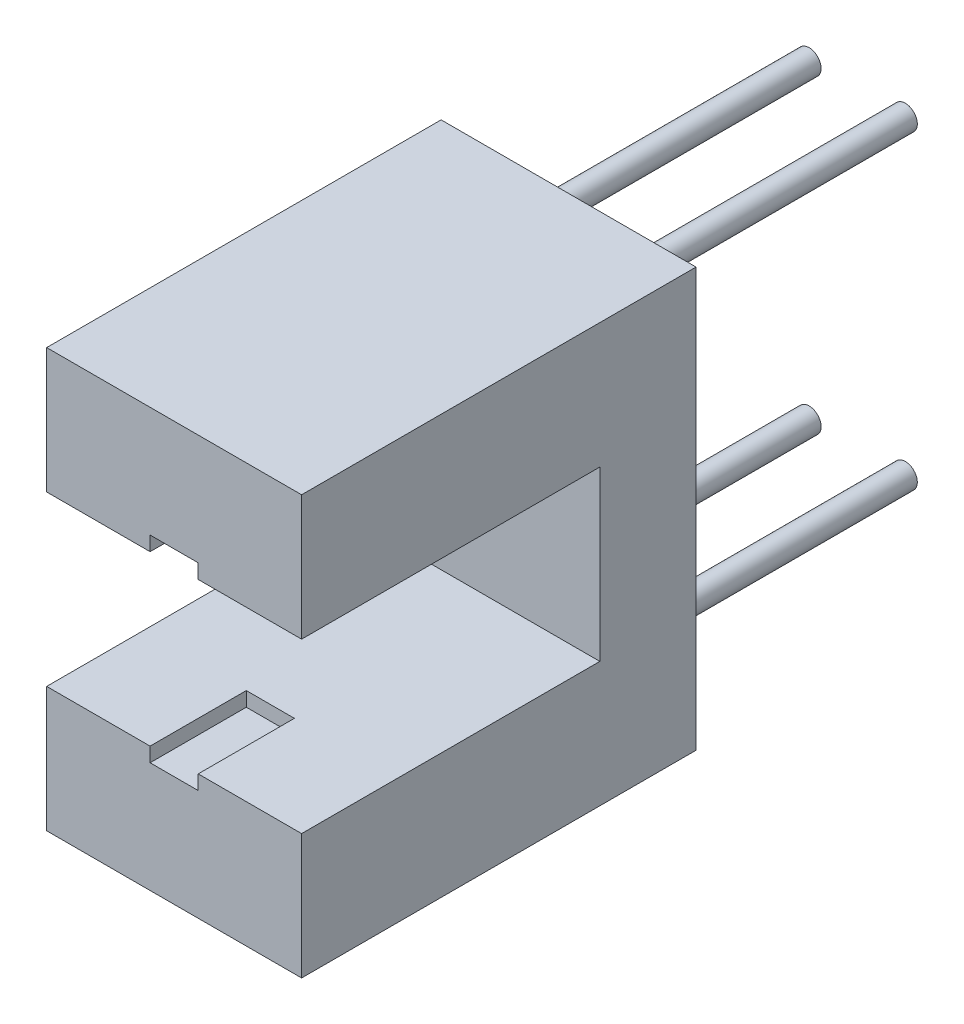
ISO-10303-21;
HEADER;
FILE_DESCRIPTION(('STEP AP214'),'2;1');
FILE_NAME('part.step','',(''),(''),'','','');
FILE_SCHEMA(('AUTOMOTIVE_DESIGN { 1 0 10303 214 1 1 1 1 }'));
ENDSEC;
DATA;
#1=APPLICATION_CONTEXT('core data for automotive mechanical design processes');
#2=APPLICATION_PROTOCOL_DEFINITION('international standard','automotive_design',2000,#1);
#3=PRODUCT_CONTEXT('',#1,'mechanical');
#4=PRODUCT('Part','Part','',(#3));
#5=PRODUCT_RELATED_PRODUCT_CATEGORY('part','',(#4));
#6=PRODUCT_DEFINITION_FORMATION('','',#4);
#7=PRODUCT_DEFINITION_CONTEXT('part definition',#1,'design');
#8=PRODUCT_DEFINITION('design','',#6,#7);
#9=PRODUCT_DEFINITION_SHAPE('','',#8);
#10=(LENGTH_UNIT() NAMED_UNIT(*) SI_UNIT(.MILLI.,.METRE.));
#11=(NAMED_UNIT(*) PLANE_ANGLE_UNIT() SI_UNIT($,.RADIAN.));
#12=(NAMED_UNIT(*) SI_UNIT($,.STERADIAN.) SOLID_ANGLE_UNIT());
#13=UNCERTAINTY_MEASURE_WITH_UNIT(LENGTH_MEASURE(1.E-05),#10,'distance_accuracy_value','');
#14=(GEOMETRIC_REPRESENTATION_CONTEXT(3) GLOBAL_UNCERTAINTY_ASSIGNED_CONTEXT((#13)) GLOBAL_UNIT_ASSIGNED_CONTEXT((#10,
#11,#12)) REPRESENTATION_CONTEXT('',''));
#15=CARTESIAN_POINT('',(0.,0.,0.));
#16=DIRECTION('',(0.,0.,1.));
#17=DIRECTION('',(1.,0.,0.));
#18=AXIS2_PLACEMENT_3D('',#15,#16,#17);
#19=CARTESIAN_POINT('',(0.,0.,0.));
#20=DIRECTION('',(0.,0.,-1.));
#21=DIRECTION('',(-0.999999999999998,0.,0.));
#22=AXIS2_PLACEMENT_3D('',#19,#20,#21);
#23=PLANE('',#22);
#24=DIRECTION('',(-0.999999999999998,0.,0.));
#25=VECTOR('',#24,1.);
#26=CARTESIAN_POINT('',(2.65000000000001,-1.74999999999993,0.));
#27=LINE('',#26,#25);
#28=CARTESIAN_POINT('',(2.65000000000001,-1.74999999999993,0.));
#29=VERTEX_POINT('',#28);
#30=CARTESIAN_POINT('',(-2.64999999999999,-1.74999999999999,0.));
#31=VERTEX_POINT('',#30);
#32=EDGE_CURVE('E240',#29,#31,#27,.T.);
#33=ORIENTED_EDGE('',*,*,#32,.F.);
#34=DIRECTION('',(0.,-1.,0.));
#35=VECTOR('',#34,1.);
#36=CARTESIAN_POINT('',(2.64999999999999,-4.34999999999998,0.));
#37=LINE('',#36,#35);
#38=CARTESIAN_POINT('',(2.65000000000001,1.75000000000006,0.));
#39=VERTEX_POINT('',#38);
#40=EDGE_CURVE('E267',#39,#29,#37,.T.);
#41=ORIENTED_EDGE('',*,*,#40,.F.);
#42=DIRECTION('',(0.999999999999998,0.,0.));
#43=VECTOR('',#42,1.);
#44=CARTESIAN_POINT('',(2.65000000000001,1.75000000000006,0.));
#45=LINE('',#44,#43);
#46=CARTESIAN_POINT('',(-2.64999999999999,1.75,0.));
#47=VERTEX_POINT('',#46);
#48=EDGE_CURVE('E295',#47,#39,#45,.T.);
#49=ORIENTED_EDGE('',*,*,#48,.F.);
#50=DIRECTION('',(0.,1.,0.));
#51=VECTOR('',#50,1.);
#52=CARTESIAN_POINT('',(-2.64999999999999,-4.35000000000001,0.));
#53=LINE('',#52,#51);
#54=EDGE_CURVE('E273',#31,#47,#53,.T.);
#55=ORIENTED_EDGE('',*,*,#54,.F.);
#56=EDGE_LOOP('',(#33,#41,#49,#55));
#57=FACE_BOUND('',#56,.T.);
#58=ADVANCED_FACE('F51',(#57),#23,.F.);
#59=CARTESIAN_POINT('',(-2.65000000000003,1.75000000000006,6.19999999999997));
#60=DIRECTION('',(0.999999999999998,0.,0.));
#61=DIRECTION('',(0.,0.,-1.));
#62=AXIS2_PLACEMENT_3D('',#59,#60,#61);
#63=PLANE('',#62);
#64=DIRECTION('',(0.,0.,-1.));
#65=VECTOR('',#64,1.);
#66=CARTESIAN_POINT('',(-2.65,4.35000000000002,6.19999999999999));
#67=LINE('',#66,#65);
#68=CARTESIAN_POINT('',(-2.65,4.35000000000002,6.19999999999999));
#69=VERTEX_POINT('',#68);
#70=CARTESIAN_POINT('',(-2.64999999999999,4.34999999999997,-2.00000000000004));
#71=VERTEX_POINT('',#70);
#72=EDGE_CURVE('E311',#69,#71,#67,.T.);
#73=ORIENTED_EDGE('',*,*,#72,.T.);
#74=DIRECTION('',(0.,1.,0.));
#75=VECTOR('',#74,1.);
#76=CARTESIAN_POINT('',(-2.64999999999999,-4.34999999999999,-1.99999999999999));
#77=LINE('',#76,#75);
#78=CARTESIAN_POINT('',(-2.64999999999999,-4.34999999999999,-1.99999999999999));
#79=VERTEX_POINT('',#78);
#80=EDGE_CURVE('E276',#79,#71,#77,.T.);
#81=ORIENTED_EDGE('',*,*,#80,.F.);
#82=DIRECTION('',(0.,0.,1.));
#83=VECTOR('',#82,1.);
#84=CARTESIAN_POINT('',(-2.64999999999999,-4.34999999999999,-1.99999999999999));
#85=LINE('',#84,#83);
#86=CARTESIAN_POINT('',(-2.64999999999999,-4.35000000000003,6.19999999999994));
#87=VERTEX_POINT('',#86);
#88=EDGE_CURVE('E284',#79,#87,#85,.T.);
#89=ORIENTED_EDGE('',*,*,#88,.T.);
#90=DIRECTION('',(0.,-1.,0.));
#91=VECTOR('',#90,1.);
#92=CARTESIAN_POINT('',(-2.64999999999996,-1.74999999999996,6.19999999999999));
#93=LINE('',#92,#91);
#94=CARTESIAN_POINT('',(-2.64999999999996,-1.74999999999996,6.19999999999999));
#95=VERTEX_POINT('',#94);
#96=EDGE_CURVE('E250',#95,#87,#93,.T.);
#97=ORIENTED_EDGE('',*,*,#96,.F.);
#98=DIRECTION('',(0.,0.,-1.));
#99=VECTOR('',#98,1.);
#100=CARTESIAN_POINT('',(-2.64999999999996,-1.74999999999996,6.19999999999999));
#101=LINE('',#100,#99);
#102=EDGE_CURVE('E258',#95,#31,#101,.T.);
#103=ORIENTED_EDGE('',*,*,#102,.T.);
#104=ORIENTED_EDGE('',*,*,#54,.T.);
#105=DIRECTION('',(0.,0.,-1.));
#106=VECTOR('',#105,1.);
#107=CARTESIAN_POINT('',(-2.65000000000003,1.75000000000006,6.19999999999997));
#108=LINE('',#107,#106);
#109=CARTESIAN_POINT('',(-2.65000000000003,1.75000000000006,6.19999999999997));
#110=VERTEX_POINT('',#109);
#111=EDGE_CURVE('E324',#110,#47,#108,.T.);
#112=ORIENTED_EDGE('',*,*,#111,.F.);
#113=DIRECTION('',(0.,-1.,0.));
#114=VECTOR('',#113,1.);
#115=CARTESIAN_POINT('',(-2.65000000000003,1.75000000000006,6.19999999999997));
#116=LINE('',#115,#114);
#117=EDGE_CURVE('E296',#69,#110,#116,.T.);
#118=ORIENTED_EDGE('',*,*,#117,.F.);
#119=EDGE_LOOP('',(#73,#81,#89,#97,#103,#104,#112,#118));
#120=FACE_BOUND('',#119,.T.);
#121=ADVANCED_FACE('F53',(#120),#63,.F.);
#122=CARTESIAN_POINT('',(2.64999999999999,1.75,6.2));
#123=DIRECTION('',(0.,1.,0.));
#124=DIRECTION('',(-0.999999999999998,0.,0.));
#125=AXIS2_PLACEMENT_3D('',#122,#123,#124);
#126=PLANE('',#125);
#127=DIRECTION('',(0.999999999999998,0.,0.));
#128=VECTOR('',#127,1.);
#129=CARTESIAN_POINT('',(2.65000000000001,1.75,4.19999999999995));
#130=LINE('',#129,#128);
#131=CARTESIAN_POINT('',(-0.500000000000028,1.74999999999997,4.19999999999996));
#132=VERTEX_POINT('',#131);
#133=CARTESIAN_POINT('',(0.500000000000028,1.75,4.20000000000001));
#134=VERTEX_POINT('',#133);
#135=EDGE_CURVE('E237',#132,#134,#130,.T.);
#136=ORIENTED_EDGE('',*,*,#135,.F.);
#137=DIRECTION('',(0.,0.,1.));
#138=VECTOR('',#137,1.);
#139=CARTESIAN_POINT('',(-0.5,1.75,6.19999999999999));
#140=LINE('',#139,#138);
#141=CARTESIAN_POINT('',(-0.5,1.75,6.19999999999999));
#142=VERTEX_POINT('',#141);
#143=EDGE_CURVE('E233',#132,#142,#140,.T.);
#144=ORIENTED_EDGE('',*,*,#143,.T.);
#145=DIRECTION('',(0.999999999999998,0.,0.));
#146=VECTOR('',#145,1.);
#147=CARTESIAN_POINT('',(2.64999999999999,1.75,6.2));
#148=LINE('',#147,#146);
#149=EDGE_CURVE('E301',#110,#142,#148,.T.);
#150=ORIENTED_EDGE('',*,*,#149,.F.);
#151=ORIENTED_EDGE('',*,*,#111,.T.);
#152=ORIENTED_EDGE('',*,*,#48,.T.);
#153=DIRECTION('',(0.,0.,-1.));
#154=VECTOR('',#153,1.);
#155=CARTESIAN_POINT('',(2.64999999999999,1.75,6.2));
#156=LINE('',#155,#154);
#157=CARTESIAN_POINT('',(2.64999999999999,1.75,6.2));
#158=VERTEX_POINT('',#157);
#159=EDGE_CURVE('E320',#158,#39,#156,.T.);
#160=ORIENTED_EDGE('',*,*,#159,.F.);
#161=CARTESIAN_POINT('',(0.499999999999987,1.75000000000006,6.19999999999996));
#162=VERTEX_POINT('',#161);
#163=EDGE_CURVE('E300',#162,#158,#148,.T.);
#164=ORIENTED_EDGE('',*,*,#163,.F.);
#165=DIRECTION('',(0.,0.,-1.));
#166=VECTOR('',#165,1.);
#167=CARTESIAN_POINT('',(0.499999999999987,1.75000000000006,6.19999999999996));
#168=LINE('',#167,#166);
#169=EDGE_CURVE('E67',#162,#134,#168,.T.);
#170=ORIENTED_EDGE('',*,*,#169,.T.);
#171=EDGE_LOOP('',(#136,#144,#150,#151,#152,#160,#164,#170));
#172=FACE_BOUND('',#171,.T.);
#173=ADVANCED_FACE('F348',(#172),#126,.F.);
#174=CARTESIAN_POINT('',(2.64999999999999,1.75,6.2));
#175=DIRECTION('',(-0.999999999999998,0.,0.));
#176=DIRECTION('',(0.,-1.,0.));
#177=AXIS2_PLACEMENT_3D('',#174,#175,#176);
#178=PLANE('',#177);
#179=ORIENTED_EDGE('',*,*,#159,.T.);
#180=ORIENTED_EDGE('',*,*,#40,.T.);
#181=DIRECTION('',(0.,0.,-1.));
#182=VECTOR('',#181,1.);
#183=CARTESIAN_POINT('',(2.64999999999999,-1.74999999999999,6.19999999999998));
#184=LINE('',#183,#182);
#185=CARTESIAN_POINT('',(2.64999999999999,-1.74999999999999,6.19999999999998));
#186=VERTEX_POINT('',#185);
#187=EDGE_CURVE('E264',#186,#29,#184,.T.);
#188=ORIENTED_EDGE('',*,*,#187,.F.);
#189=DIRECTION('',(0.,1.,0.));
#190=VECTOR('',#189,1.);
#191=CARTESIAN_POINT('',(2.64999999999999,-1.74999999999999,6.19999999999998));
#192=LINE('',#191,#190);
#193=CARTESIAN_POINT('',(2.65,-4.34999999999999,6.19999999999996));
#194=VERTEX_POINT('',#193);
#195=EDGE_CURVE('E241',#194,#186,#192,.T.);
#196=ORIENTED_EDGE('',*,*,#195,.F.);
#197=DIRECTION('',(0.,0.,1.));
#198=VECTOR('',#197,1.);
#199=CARTESIAN_POINT('',(2.64999999999999,-4.35000000000003,-2.00000000000003));
#200=LINE('',#199,#198);
#201=CARTESIAN_POINT('',(2.64999999999999,-4.35000000000003,-2.00000000000003));
#202=VERTEX_POINT('',#201);
#203=EDGE_CURVE('E292',#202,#194,#200,.T.);
#204=ORIENTED_EDGE('',*,*,#203,.F.);
#205=DIRECTION('',(0.,-1.,0.));
#206=VECTOR('',#205,1.);
#207=CARTESIAN_POINT('',(2.64999999999999,-4.35000000000003,-2.00000000000003));
#208=LINE('',#207,#206);
#209=CARTESIAN_POINT('',(2.65000000000004,4.35000000000005,-2.00000000000002));
#210=VERTEX_POINT('',#209);
#211=EDGE_CURVE('E268',#210,#202,#208,.T.);
#212=ORIENTED_EDGE('',*,*,#211,.F.);
#213=DIRECTION('',(0.,0.,-1.));
#214=VECTOR('',#213,1.);
#215=CARTESIAN_POINT('',(2.64999999999999,4.34999999999999,6.2));
#216=LINE('',#215,#214);
#217=CARTESIAN_POINT('',(2.64999999999999,4.34999999999999,6.2));
#218=VERTEX_POINT('',#217);
#219=EDGE_CURVE('E317',#218,#210,#216,.T.);
#220=ORIENTED_EDGE('',*,*,#219,.F.);
#221=DIRECTION('',(0.,1.,0.));
#222=VECTOR('',#221,1.);
#223=CARTESIAN_POINT('',(2.64999999999999,1.75,6.2));
#224=LINE('',#223,#222);
#225=EDGE_CURVE('E305',#158,#218,#224,.T.);
#226=ORIENTED_EDGE('',*,*,#225,.F.);
#227=EDGE_LOOP('',(#179,#180,#188,#196,#204,#212,#220,#226));
#228=FACE_BOUND('',#227,.T.);
#229=ADVANCED_FACE('F351',(#228),#178,.F.);
#230=CARTESIAN_POINT('',(2.64999999999999,4.34999999999999,6.2));
#231=DIRECTION('',(0.,-1.,0.));
#232=DIRECTION('',(0.999999999999999,0.,0.));
#233=AXIS2_PLACEMENT_3D('',#230,#231,#232);
#234=PLANE('',#233);
#235=ORIENTED_EDGE('',*,*,#219,.T.);
#236=DIRECTION('',(0.999999999999998,0.,0.));
#237=VECTOR('',#236,1.);
#238=CARTESIAN_POINT('',(-2.64999999999999,4.34999999999997,-2.00000000000004));
#239=LINE('',#238,#237);
#240=EDGE_CURVE('E280',#71,#210,#239,.T.);
#241=ORIENTED_EDGE('',*,*,#240,.F.);
#242=ORIENTED_EDGE('',*,*,#72,.F.);
#243=DIRECTION('',(-0.999999999999999,0.,0.));
#244=VECTOR('',#243,1.);
#245=CARTESIAN_POINT('',(2.64999999999999,4.34999999999999,6.2));
#246=LINE('',#245,#244);
#247=EDGE_CURVE('E308',#218,#69,#246,.T.);
#248=ORIENTED_EDGE('',*,*,#247,.F.);
#249=EDGE_LOOP('',(#235,#241,#242,#248));
#250=FACE_BOUND('',#249,.T.);
#251=ADVANCED_FACE('F358',(#250),#234,.F.);
#252=CARTESIAN_POINT('',(0.,0.,6.19999999999999));
#253=DIRECTION('',(0.,0.,1.));
#254=DIRECTION('',(0.999999999999998,0.,0.));
#255=AXIS2_PLACEMENT_3D('',#252,#253,#254);
#256=PLANE('',#255);
#257=DIRECTION('',(0.,-1.,0.));
#258=VECTOR('',#257,1.);
#259=CARTESIAN_POINT('',(-0.499999999999945,-2.04999999999998,6.20000000000001));
#260=LINE('',#259,#258);
#261=CARTESIAN_POINT('',(-0.500000000000028,2.05,6.20000000000001));
#262=VERTEX_POINT('',#261);
#263=EDGE_CURVE('E201',#262,#142,#260,.T.);
#264=ORIENTED_EDGE('',*,*,#263,.F.);
#265=DIRECTION('',(-0.999999999999998,0.,0.));
#266=VECTOR('',#265,1.);
#267=CARTESIAN_POINT('',(0.500000000000042,2.05,6.19999999999997));
#268=LINE('',#267,#266);
#269=CARTESIAN_POINT('',(0.500000000000042,2.05,6.19999999999997));
#270=VERTEX_POINT('',#269);
#271=EDGE_CURVE('E176',#270,#262,#268,.T.);
#272=ORIENTED_EDGE('',*,*,#271,.F.);
#273=DIRECTION('',(0.,1.,0.));
#274=VECTOR('',#273,1.);
#275=CARTESIAN_POINT('',(0.5,-2.05000000000005,6.19999999999997));
#276=LINE('',#275,#274);
#277=EDGE_CURVE('E208',#162,#270,#276,.T.);
#278=ORIENTED_EDGE('',*,*,#277,.F.);
#279=ORIENTED_EDGE('',*,*,#163,.T.);
#280=ORIENTED_EDGE('',*,*,#225,.T.);
#281=ORIENTED_EDGE('',*,*,#247,.T.);
#282=ORIENTED_EDGE('',*,*,#117,.T.);
#283=ORIENTED_EDGE('',*,*,#149,.T.);
#284=EDGE_LOOP('',(#264,#272,#278,#279,#280,#281,#282,#283));
#285=FACE_BOUND('',#284,.T.);
#286=ADVANCED_FACE('F342',(#285),#256,.T.);
#287=CARTESIAN_POINT('',(-2.64999999999999,-4.34999999999999,-1.99999999999999));
#288=DIRECTION('',(0.,1.,0.));
#289=DIRECTION('',(0.,0.,1.));
#290=AXIS2_PLACEMENT_3D('',#287,#288,#289);
#291=PLANE('',#290);
#292=ORIENTED_EDGE('',*,*,#203,.T.);
#293=DIRECTION('',(0.999999999999998,0.,0.));
#294=VECTOR('',#293,1.);
#295=CARTESIAN_POINT('',(2.65,-4.34999999999999,6.19999999999996));
#296=LINE('',#295,#294);
#297=EDGE_CURVE('E254',#87,#194,#296,.T.);
#298=ORIENTED_EDGE('',*,*,#297,.F.);
#299=ORIENTED_EDGE('',*,*,#88,.F.);
#300=DIRECTION('',(-0.999999999999998,0.,0.));
#301=VECTOR('',#300,1.);
#302=CARTESIAN_POINT('',(-2.64999999999999,-4.34999999999999,-1.99999999999999));
#303=LINE('',#302,#301);
#304=EDGE_CURVE('E272',#202,#79,#303,.T.);
#305=ORIENTED_EDGE('',*,*,#304,.F.);
#306=EDGE_LOOP('',(#292,#298,#299,#305));
#307=FACE_BOUND('',#306,.T.);
#308=ADVANCED_FACE('F411',(#307),#291,.F.);
#309=CARTESIAN_POINT('',(0.,0.,-2.00000000000004));
#310=DIRECTION('',(0.,0.,-1.));
#311=DIRECTION('',(-0.999999999999998,0.,0.));
#312=AXIS2_PLACEMENT_3D('',#309,#310,#311);
#313=PLANE('',#312);
#314=CARTESIAN_POINT('',(0.999999999999973,3.225,-2.00000000000004));
#315=DIRECTION('',(0.,0.,-1.));
#316=DIRECTION('',(1.,0.,0.));
#317=AXIS2_PLACEMENT_3D('',#314,#315,#316);
#318=CIRCLE('',#317,0.25);
#319=CARTESIAN_POINT('',(1.24999999999997,3.225,-2.00000000000004));
#320=VERTEX_POINT('',#319);
#321=EDGE_CURVE('E400',#320,#320,#318,.T.);
#322=ORIENTED_EDGE('',*,*,#321,.F.);
#323=EDGE_LOOP('',(#322));
#324=FACE_BOUND('',#323,.T.);
#325=CARTESIAN_POINT('',(-1.,3.22500000000001,-2.00000000000004));
#326=DIRECTION('',(0.,0.,-1.));
#327=DIRECTION('',(-1.,0.,0.));
#328=AXIS2_PLACEMENT_3D('',#325,#326,#327);
#329=CIRCLE('',#328,0.25);
#330=CARTESIAN_POINT('',(-1.25,3.22500000000001,-2.00000000000004));
#331=VERTEX_POINT('',#330);
#332=EDGE_CURVE('E392',#331,#331,#329,.T.);
#333=ORIENTED_EDGE('',*,*,#332,.F.);
#334=EDGE_LOOP('',(#333));
#335=FACE_BOUND('',#334,.T.);
#336=CARTESIAN_POINT('',(-1.,-3.22500000000001,-2.00000000000004));
#337=DIRECTION('',(0.,0.,-1.));
#338=DIRECTION('',(1.,0.,0.));
#339=AXIS2_PLACEMENT_3D('',#336,#337,#338);
#340=CIRCLE('',#339,0.25);
#341=CARTESIAN_POINT('',(-0.750000000000002,-3.22500000000001,-2.00000000000004));
#342=VERTEX_POINT('',#341);
#343=EDGE_CURVE('E384',#342,#342,#340,.T.);
#344=ORIENTED_EDGE('',*,*,#343,.F.);
#345=EDGE_LOOP('',(#344));
#346=FACE_BOUND('',#345,.T.);
#347=CARTESIAN_POINT('',(0.999999999999973,-3.225,-2.00000000000004));
#348=DIRECTION('',(0.,0.,-1.));
#349=DIRECTION('',(-1.,0.,0.));
#350=AXIS2_PLACEMENT_3D('',#347,#348,#349);
#351=CIRCLE('',#350,0.25);
#352=CARTESIAN_POINT('',(0.749999999999973,-3.225,-2.00000000000004));
#353=VERTEX_POINT('',#352);
#354=EDGE_CURVE('E377',#353,#353,#351,.T.);
#355=ORIENTED_EDGE('',*,*,#354,.F.);
#356=EDGE_LOOP('',(#355));
#357=FACE_BOUND('',#356,.T.);
#358=ORIENTED_EDGE('',*,*,#211,.T.);
#359=ORIENTED_EDGE('',*,*,#304,.T.);
#360=ORIENTED_EDGE('',*,*,#80,.T.);
#361=ORIENTED_EDGE('',*,*,#240,.T.);
#362=EDGE_LOOP('',(#358,#359,#360,#361));
#363=FACE_BOUND('',#362,.T.);
#364=ADVANCED_FACE('F408',(#324,#335,#346,#357,#363),#313,.T.);
#365=CARTESIAN_POINT('',(2.64999999999999,-1.74999999999999,6.19999999999998));
#366=DIRECTION('',(0.,-1.,0.));
#367=DIRECTION('',(0.999999999999998,0.,0.));
#368=AXIS2_PLACEMENT_3D('',#365,#366,#367);
#369=PLANE('',#368);
#370=DIRECTION('',(-0.999999999999998,0.,0.));
#371=VECTOR('',#370,1.);
#372=CARTESIAN_POINT('',(2.64999999999999,-1.74999999999999,6.19999999999998));
#373=LINE('',#372,#371);
#374=CARTESIAN_POINT('',(-0.499999999999987,-1.75,6.19999999999996));
#375=VERTEX_POINT('',#374);
#376=EDGE_CURVE('E245',#375,#95,#373,.T.);
#377=ORIENTED_EDGE('',*,*,#376,.F.);
#378=DIRECTION('',(0.,0.,-1.));
#379=VECTOR('',#378,1.);
#380=CARTESIAN_POINT('',(-0.499999999999987,-1.75,6.19999999999996));
#381=LINE('',#380,#379);
#382=CARTESIAN_POINT('',(-0.5,-1.75000000000002,4.20000000000001));
#383=VERTEX_POINT('',#382);
#384=EDGE_CURVE('E230',#375,#383,#381,.T.);
#385=ORIENTED_EDGE('',*,*,#384,.T.);
#386=DIRECTION('',(-0.999999999999998,0.,0.));
#387=VECTOR('',#386,1.);
#388=CARTESIAN_POINT('',(2.64999999999997,-1.75,4.19999999999997));
#389=LINE('',#388,#387);
#390=CARTESIAN_POINT('',(0.500000000000014,-1.75,4.2));
#391=VERTEX_POINT('',#390);
#392=EDGE_CURVE('E13',#391,#383,#389,.T.);
#393=ORIENTED_EDGE('',*,*,#392,.F.);
#394=DIRECTION('',(0.,0.,1.));
#395=VECTOR('',#394,1.);
#396=CARTESIAN_POINT('',(0.5,-1.74999999999997,6.19999999999996));
#397=LINE('',#396,#395);
#398=CARTESIAN_POINT('',(0.5,-1.74999999999997,6.19999999999996));
#399=VERTEX_POINT('',#398);
#400=EDGE_CURVE('E218',#391,#399,#397,.T.);
#401=ORIENTED_EDGE('',*,*,#400,.T.);
#402=EDGE_CURVE('E246',#186,#399,#373,.T.);
#403=ORIENTED_EDGE('',*,*,#402,.F.);
#404=ORIENTED_EDGE('',*,*,#187,.T.);
#405=ORIENTED_EDGE('',*,*,#32,.T.);
#406=ORIENTED_EDGE('',*,*,#102,.F.);
#407=EDGE_LOOP('',(#377,#385,#393,#401,#403,#404,#405,#406));
#408=FACE_BOUND('',#407,.T.);
#409=ADVANCED_FACE('F334',(#408),#369,.F.);
#410=CARTESIAN_POINT('',(0.,0.,6.19999999999999));
#411=DIRECTION('',(0.,0.,-1.));
#412=DIRECTION('',(-0.999999999999998,0.,0.));
#413=AXIS2_PLACEMENT_3D('',#410,#411,#412);
#414=PLANE('',#413);
#415=DIRECTION('',(0.999999999999998,0.,0.));
#416=VECTOR('',#415,1.);
#417=CARTESIAN_POINT('',(0.5,-2.05000000000005,6.19999999999997));
#418=LINE('',#417,#416);
#419=CARTESIAN_POINT('',(-0.499999999999945,-2.04999999999998,6.20000000000001));
#420=VERTEX_POINT('',#419);
#421=CARTESIAN_POINT('',(0.5,-2.05000000000005,6.19999999999997));
#422=VERTEX_POINT('',#421);
#423=EDGE_CURVE('E204',#420,#422,#418,.T.);
#424=ORIENTED_EDGE('',*,*,#423,.F.);
#425=DIRECTION('',(0.,1.,0.));
#426=VECTOR('',#425,1.);
#427=CARTESIAN_POINT('',(-0.499999999999987,0.,6.19999999999996));
#428=LINE('',#427,#426);
#429=EDGE_CURVE('E60',#420,#375,#428,.T.);
#430=ORIENTED_EDGE('',*,*,#429,.T.);
#431=ORIENTED_EDGE('',*,*,#376,.T.);
#432=ORIENTED_EDGE('',*,*,#96,.T.);
#433=ORIENTED_EDGE('',*,*,#297,.T.);
#434=ORIENTED_EDGE('',*,*,#195,.T.);
#435=ORIENTED_EDGE('',*,*,#402,.T.);
#436=EDGE_CURVE('E209',#422,#399,#276,.T.);
#437=ORIENTED_EDGE('',*,*,#436,.F.);
#438=EDGE_LOOP('',(#424,#430,#431,#432,#433,#434,#435,#437));
#439=FACE_BOUND('',#438,.T.);
#440=ADVANCED_FACE('F330',(#439),#414,.F.);
#441=CARTESIAN_POINT('',(0.499999999999973,-2.05,4.19999999999996));
#442=DIRECTION('',(0.,-1.,0.));
#443=DIRECTION('',(0.,0.,-1.));
#444=AXIS2_PLACEMENT_3D('',#441,#442,#443);
#445=PLANE('',#444);
#446=ORIENTED_EDGE('',*,*,#423,.T.);
#447=DIRECTION('',(0.,0.,1.));
#448=VECTOR('',#447,1.);
#449=CARTESIAN_POINT('',(0.499999999999973,-2.05,4.19999999999996));
#450=LINE('',#449,#448);
#451=CARTESIAN_POINT('',(0.499999999999973,-2.05,4.19999999999996));
#452=VERTEX_POINT('',#451);
#453=EDGE_CURVE('E182',#452,#422,#450,.T.);
#454=ORIENTED_EDGE('',*,*,#453,.F.);
#455=DIRECTION('',(0.999999999999998,0.,0.));
#456=VECTOR('',#455,1.);
#457=CARTESIAN_POINT('',(0.499999999999973,-2.05,4.19999999999996));
#458=LINE('',#457,#456);
#459=CARTESIAN_POINT('',(-0.500000000000014,-2.05,4.19999999999996));
#460=VERTEX_POINT('',#459);
#461=EDGE_CURVE('E170',#460,#452,#458,.T.);
#462=ORIENTED_EDGE('',*,*,#461,.F.);
#463=DIRECTION('',(0.,0.,1.));
#464=VECTOR('',#463,1.);
#465=CARTESIAN_POINT('',(-0.500000000000014,-2.05,4.19999999999996));
#466=LINE('',#465,#464);
#467=EDGE_CURVE('E75',#460,#420,#466,.T.);
#468=ORIENTED_EDGE('',*,*,#467,.T.);
#469=EDGE_LOOP('',(#446,#454,#462,#468));
#470=FACE_BOUND('',#469,.T.);
#471=ADVANCED_FACE('F185',(#470),#445,.F.);
#472=CARTESIAN_POINT('',(0.499999999999973,-2.05,4.19999999999996));
#473=DIRECTION('',(0.999999999999998,0.,0.));
#474=DIRECTION('',(0.,0.,-1.));
#475=AXIS2_PLACEMENT_3D('',#472,#473,#474);
#476=PLANE('',#475);
#477=DIRECTION('',(0.,1.,0.));
#478=VECTOR('',#477,1.);
#479=CARTESIAN_POINT('',(0.499999999999973,-2.05,4.19999999999996));
#480=LINE('',#479,#478);
#481=EDGE_CURVE('E192',#452,#391,#480,.T.);
#482=ORIENTED_EDGE('',*,*,#481,.F.);
#483=ORIENTED_EDGE('',*,*,#453,.T.);
#484=ORIENTED_EDGE('',*,*,#436,.T.);
#485=ORIENTED_EDGE('',*,*,#400,.F.);
#486=EDGE_LOOP('',(#482,#483,#484,#485));
#487=FACE_BOUND('',#486,.T.);
#488=ADVANCED_FACE('F428',(#487),#476,.F.);
#489=CARTESIAN_POINT('',(-0.500000000000014,-2.05,4.19999999999996));
#490=DIRECTION('',(-0.999999999999998,0.,0.));
#491=DIRECTION('',(0.,0.,1.));
#492=AXIS2_PLACEMENT_3D('',#489,#490,#491);
#493=PLANE('',#492);
#494=ORIENTED_EDGE('',*,*,#429,.F.);
#495=ORIENTED_EDGE('',*,*,#467,.F.);
#496=DIRECTION('',(0.,-1.,0.));
#497=VECTOR('',#496,1.);
#498=CARTESIAN_POINT('',(-0.500000000000014,-2.05,4.19999999999996));
#499=LINE('',#498,#497);
#500=EDGE_CURVE('E167',#383,#460,#499,.T.);
#501=ORIENTED_EDGE('',*,*,#500,.F.);
#502=ORIENTED_EDGE('',*,*,#384,.F.);
#503=EDGE_LOOP('',(#494,#495,#501,#502));
#504=FACE_BOUND('',#503,.T.);
#505=ADVANCED_FACE('F178',(#504),#493,.F.);
#506=CARTESIAN_POINT('',(0.,0.,4.19999999999998));
#507=DIRECTION('',(0.,0.,1.));
#508=DIRECTION('',(0.999999999999998,0.,0.));
#509=AXIS2_PLACEMENT_3D('',#506,#507,#508);
#510=PLANE('',#509);
#511=ORIENTED_EDGE('',*,*,#392,.T.);
#512=ORIENTED_EDGE('',*,*,#500,.T.);
#513=ORIENTED_EDGE('',*,*,#461,.T.);
#514=ORIENTED_EDGE('',*,*,#481,.T.);
#515=EDGE_LOOP('',(#511,#512,#513,#514));
#516=FACE_BOUND('',#515,.T.);
#517=ADVANCED_FACE('F168',(#516),#510,.T.);
#518=ORIENTED_EDGE('',*,*,#135,.T.);
#519=CARTESIAN_POINT('',(0.499999999999973,2.05000000000002,4.19999999999996));
#520=VERTEX_POINT('',#519);
#521=EDGE_CURVE('E188',#134,#520,#480,.T.);
#522=ORIENTED_EDGE('',*,*,#521,.T.);
#523=DIRECTION('',(-0.999999999999998,0.,0.));
#524=VECTOR('',#523,1.);
#525=CARTESIAN_POINT('',(0.499999999999973,2.05000000000002,4.19999999999996));
#526=LINE('',#525,#524);
#527=CARTESIAN_POINT('',(-0.500000000000014,2.05000000000002,4.19999999999996));
#528=VERTEX_POINT('',#527);
#529=EDGE_CURVE('E183',#520,#528,#526,.T.);
#530=ORIENTED_EDGE('',*,*,#529,.T.);
#531=EDGE_CURVE('E175',#528,#132,#499,.T.);
#532=ORIENTED_EDGE('',*,*,#531,.T.);
#533=EDGE_LOOP('',(#518,#522,#530,#532));
#534=FACE_BOUND('',#533,.T.);
#535=ADVANCED_FACE('F367',(#534),#510,.T.);
#536=ORIENTED_EDGE('',*,*,#531,.F.);
#537=DIRECTION('',(0.,0.,1.));
#538=VECTOR('',#537,1.);
#539=CARTESIAN_POINT('',(-0.500000000000014,2.05000000000002,4.19999999999996));
#540=LINE('',#539,#538);
#541=EDGE_CURVE('E215',#528,#262,#540,.T.);
#542=ORIENTED_EDGE('',*,*,#541,.T.);
#543=ORIENTED_EDGE('',*,*,#263,.T.);
#544=ORIENTED_EDGE('',*,*,#143,.F.);
#545=EDGE_LOOP('',(#536,#542,#543,#544));
#546=FACE_BOUND('',#545,.T.);
#547=ADVANCED_FACE('F365',(#546),#493,.F.);
#548=ORIENTED_EDGE('',*,*,#277,.T.);
#549=DIRECTION('',(0.,0.,1.));
#550=VECTOR('',#549,1.);
#551=CARTESIAN_POINT('',(0.499999999999973,2.05000000000002,4.19999999999996));
#552=LINE('',#551,#550);
#553=EDGE_CURVE('E219',#520,#270,#552,.T.);
#554=ORIENTED_EDGE('',*,*,#553,.F.);
#555=ORIENTED_EDGE('',*,*,#521,.F.);
#556=ORIENTED_EDGE('',*,*,#169,.F.);
#557=EDGE_LOOP('',(#548,#554,#555,#556));
#558=FACE_BOUND('',#557,.T.);
#559=ADVANCED_FACE('F372',(#558),#476,.F.);
#560=CARTESIAN_POINT('',(0.499999999999973,2.05000000000002,4.19999999999996));
#561=DIRECTION('',(0.,1.,0.));
#562=DIRECTION('',(0.,0.,1.));
#563=AXIS2_PLACEMENT_3D('',#560,#561,#562);
#564=PLANE('',#563);
#565=ORIENTED_EDGE('',*,*,#271,.T.);
#566=ORIENTED_EDGE('',*,*,#541,.F.);
#567=ORIENTED_EDGE('',*,*,#529,.F.);
#568=ORIENTED_EDGE('',*,*,#553,.T.);
#569=EDGE_LOOP('',(#565,#566,#567,#568));
#570=FACE_BOUND('',#569,.T.);
#571=ADVANCED_FACE('F371',(#570),#564,.F.);
#572=CARTESIAN_POINT('',(0.999999999999969,-3.225,-8.00000000000004));
#573=DIRECTION('',(0.,0.,1.));
#574=DIRECTION('',(1.,0.,0.));
#575=AXIS2_PLACEMENT_3D('',#572,#573,#574);
#576=CYLINDRICAL_SURFACE('',#575,0.25);
#577=CARTESIAN_POINT('',(0.999999999999969,-3.225,-8.00000000000004));
#578=DIRECTION('',(0.,0.,-1.));
#579=DIRECTION('',(-1.,0.,0.));
#580=AXIS2_PLACEMENT_3D('',#577,#578,#579);
#581=CIRCLE('',#580,0.25);
#582=CARTESIAN_POINT('',(0.749999999999969,-3.225,-8.00000000000004));
#583=VERTEX_POINT('',#582);
#584=EDGE_CURVE('E205',#583,#583,#581,.T.);
#585=ORIENTED_EDGE('',*,*,#584,.F.);
#586=EDGE_LOOP('',(#585));
#587=FACE_BOUND('',#586,.T.);
#588=ORIENTED_EDGE('',*,*,#354,.T.);
#589=EDGE_LOOP('',(#588));
#590=FACE_BOUND('',#589,.T.);
#591=ADVANCED_FACE('F540',(#587,#590),#576,.T.);
#592=CARTESIAN_POINT('',(0.999999999999969,-3.225,-8.00000000000004));
#593=DIRECTION('',(0.,0.,-1.));
#594=DIRECTION('',(-1.,0.,0.));
#595=AXIS2_PLACEMENT_3D('',#592,#593,#594);
#596=PLANE('',#595);
#597=ORIENTED_EDGE('',*,*,#584,.T.);
#598=EDGE_LOOP('',(#597));
#599=FACE_BOUND('',#598,.T.);
#600=ADVANCED_FACE('F548',(#599),#596,.T.);
#601=CARTESIAN_POINT('',(-1.00000000000001,-3.22500000000001,-8.00000000000004));
#602=DIRECTION('',(0.,0.,1.));
#603=DIRECTION('',(1.,0.,0.));
#604=AXIS2_PLACEMENT_3D('',#601,#602,#603);
#605=CYLINDRICAL_SURFACE('',#604,0.25);
#606=CARTESIAN_POINT('',(-1.00000000000001,-3.22500000000001,-8.00000000000004));
#607=DIRECTION('',(0.,0.,-1.));
#608=DIRECTION('',(1.,0.,0.));
#609=AXIS2_PLACEMENT_3D('',#606,#607,#608);
#610=CIRCLE('',#609,0.25);
#611=CARTESIAN_POINT('',(-0.750000000000006,-3.22500000000001,-8.00000000000004));
#612=VERTEX_POINT('',#611);
#613=EDGE_CURVE('E381',#612,#612,#610,.T.);
#614=ORIENTED_EDGE('',*,*,#613,.F.);
#615=EDGE_LOOP('',(#614));
#616=FACE_BOUND('',#615,.T.);
#617=ORIENTED_EDGE('',*,*,#343,.T.);
#618=EDGE_LOOP('',(#617));
#619=FACE_BOUND('',#618,.T.);
#620=ADVANCED_FACE('F558',(#616,#619),#605,.T.);
#621=CARTESIAN_POINT('',(-1.00000000000001,-3.22500000000001,-8.00000000000004));
#622=DIRECTION('',(0.,0.,1.));
#623=DIRECTION('',(1.,0.,0.));
#624=AXIS2_PLACEMENT_3D('',#621,#622,#623);
#625=PLANE('',#624);
#626=ORIENTED_EDGE('',*,*,#613,.T.);
#627=EDGE_LOOP('',(#626));
#628=FACE_BOUND('',#627,.T.);
#629=ADVANCED_FACE('F568',(#628),#625,.F.);
#630=CARTESIAN_POINT('',(-1.00000000000001,3.22500000000001,-8.00000000000004));
#631=DIRECTION('',(0.,0.,1.));
#632=DIRECTION('',(1.,0.,0.));
#633=AXIS2_PLACEMENT_3D('',#630,#631,#632);
#634=CYLINDRICAL_SURFACE('',#633,0.25);
#635=CARTESIAN_POINT('',(-1.00000000000001,3.22500000000001,-8.00000000000004));
#636=DIRECTION('',(0.,0.,-1.));
#637=DIRECTION('',(-1.,0.,0.));
#638=AXIS2_PLACEMENT_3D('',#635,#636,#637);
#639=CIRCLE('',#638,0.25);
#640=CARTESIAN_POINT('',(-1.25000000000001,3.22500000000001,-8.00000000000004));
#641=VERTEX_POINT('',#640);
#642=EDGE_CURVE('E388',#641,#641,#639,.T.);
#643=ORIENTED_EDGE('',*,*,#642,.F.);
#644=EDGE_LOOP('',(#643));
#645=FACE_BOUND('',#644,.T.);
#646=ORIENTED_EDGE('',*,*,#332,.T.);
#647=EDGE_LOOP('',(#646));
#648=FACE_BOUND('',#647,.T.);
#649=ADVANCED_FACE('F578',(#645,#648),#634,.T.);
#650=CARTESIAN_POINT('',(-1.00000000000001,3.22500000000001,-8.00000000000004));
#651=DIRECTION('',(0.,0.,-1.));
#652=DIRECTION('',(-1.,0.,0.));
#653=AXIS2_PLACEMENT_3D('',#650,#651,#652);
#654=PLANE('',#653);
#655=ORIENTED_EDGE('',*,*,#642,.T.);
#656=EDGE_LOOP('',(#655));
#657=FACE_BOUND('',#656,.T.);
#658=ADVANCED_FACE('F588',(#657),#654,.T.);
#659=CARTESIAN_POINT('',(0.999999999999969,3.225,-8.00000000000004));
#660=DIRECTION('',(0.,0.,1.));
#661=DIRECTION('',(1.,0.,0.));
#662=AXIS2_PLACEMENT_3D('',#659,#660,#661);
#663=CYLINDRICAL_SURFACE('',#662,0.25);
#664=CARTESIAN_POINT('',(0.999999999999969,3.225,-8.00000000000004));
#665=DIRECTION('',(0.,0.,-1.));
#666=DIRECTION('',(1.,0.,0.));
#667=AXIS2_PLACEMENT_3D('',#664,#665,#666);
#668=CIRCLE('',#667,0.25);
#669=CARTESIAN_POINT('',(1.24999999999997,3.225,-8.00000000000004));
#670=VERTEX_POINT('',#669);
#671=EDGE_CURVE('E396',#670,#670,#668,.T.);
#672=ORIENTED_EDGE('',*,*,#671,.F.);
#673=EDGE_LOOP('',(#672));
#674=FACE_BOUND('',#673,.T.);
#675=ORIENTED_EDGE('',*,*,#321,.T.);
#676=EDGE_LOOP('',(#675));
#677=FACE_BOUND('',#676,.T.);
#678=ADVANCED_FACE('F406',(#674,#677),#663,.T.);
#679=CARTESIAN_POINT('',(0.999999999999969,3.225,-8.00000000000004));
#680=DIRECTION('',(0.,0.,1.));
#681=DIRECTION('',(1.,0.,0.));
#682=AXIS2_PLACEMENT_3D('',#679,#680,#681);
#683=PLANE('',#682);
#684=ORIENTED_EDGE('',*,*,#671,.T.);
#685=EDGE_LOOP('',(#684));
#686=FACE_BOUND('',#685,.T.);
#687=ADVANCED_FACE('F607',(#686),#683,.F.);
#688=CLOSED_SHELL('',(#58,#121,#173,#229,#251,#286,#308,#364,#409,#440,#471,#488,#505,#517,#535,
#547,#559,#571,#591,#600,#620,#629,#649,#658,#678,#687));
#689=MANIFOLD_SOLID_BREP('B2',#688);
#690=ADVANCED_BREP_SHAPE_REPRESENTATION('',(#18,#689),#14);
#691=SHAPE_DEFINITION_REPRESENTATION(#9,#690);
ENDSEC;
END-ISO-10303-21;
